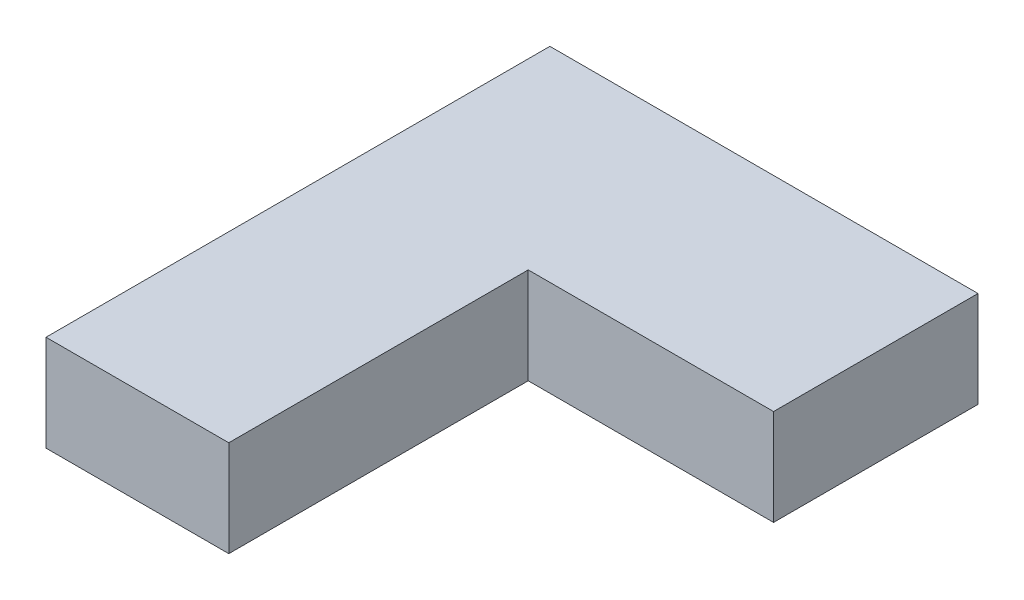
ISO-10303-21;
HEADER;
FILE_DESCRIPTION(('STEP AP214'),'2;1');
FILE_NAME('part.step','',(''),(''),'','','');
FILE_SCHEMA(('AUTOMOTIVE_DESIGN { 1 0 10303 214 1 1 1 1 }'));
ENDSEC;
DATA;
#1=APPLICATION_CONTEXT('core data for automotive mechanical design processes');
#2=APPLICATION_PROTOCOL_DEFINITION('international standard','automotive_design',2000,#1);
#3=PRODUCT_CONTEXT('',#1,'mechanical');
#4=PRODUCT('Part','Part','',(#3));
#5=PRODUCT_RELATED_PRODUCT_CATEGORY('part','',(#4));
#6=PRODUCT_DEFINITION_FORMATION('','',#4);
#7=PRODUCT_DEFINITION_CONTEXT('part definition',#1,'design');
#8=PRODUCT_DEFINITION('design','',#6,#7);
#9=PRODUCT_DEFINITION_SHAPE('','',#8);
#10=(LENGTH_UNIT() NAMED_UNIT(*) SI_UNIT(.MILLI.,.METRE.));
#11=(NAMED_UNIT(*) PLANE_ANGLE_UNIT() SI_UNIT($,.RADIAN.));
#12=(NAMED_UNIT(*) SI_UNIT($,.STERADIAN.) SOLID_ANGLE_UNIT());
#13=UNCERTAINTY_MEASURE_WITH_UNIT(LENGTH_MEASURE(1.E-05),#10,'distance_accuracy_value','');
#14=(GEOMETRIC_REPRESENTATION_CONTEXT(3) GLOBAL_UNCERTAINTY_ASSIGNED_CONTEXT((#13)) GLOBAL_UNIT_ASSIGNED_CONTEXT((#10,
#11,#12)) REPRESENTATION_CONTEXT('',''));
#15=CARTESIAN_POINT('',(0.,0.,0.));
#16=DIRECTION('',(0.,0.,1.));
#17=DIRECTION('',(1.,0.,0.));
#18=AXIS2_PLACEMENT_3D('',#15,#16,#17);
#19=CARTESIAN_POINT('',(44.5690110838464,10.,-52.456223719471));
#20=DIRECTION('',(1.,0.,0.));
#21=DIRECTION('',(0.,0.,-1.));
#22=AXIS2_PLACEMENT_3D('',#19,#20,#21);
#23=PLANE('',#22);
#24=DIRECTION('',(0.,0.,1.));
#25=VECTOR('',#24,1.);
#26=CARTESIAN_POINT('',(44.5690110838464,0.,-52.456223719471));
#27=LINE('',#26,#25);
#28=CARTESIAN_POINT('',(44.5690110838464,0.,-52.456223719471));
#29=VERTEX_POINT('',#28);
#30=CARTESIAN_POINT('',(44.5690110838464,0.,-31.1732689884207));
#31=VERTEX_POINT('',#30);
#32=EDGE_CURVE('E118',#29,#31,#27,.T.);
#33=ORIENTED_EDGE('',*,*,#32,.F.);
#34=DIRECTION('',(0.,-1.,0.));
#35=VECTOR('',#34,1.);
#36=CARTESIAN_POINT('',(44.5690110838464,10.,-52.456223719471));
#37=LINE('',#36,#35);
#38=CARTESIAN_POINT('',(44.5690110838464,10.,-52.456223719471));
#39=VERTEX_POINT('',#38);
#40=EDGE_CURVE('E11',#39,#29,#37,.T.);
#41=ORIENTED_EDGE('',*,*,#40,.F.);
#42=DIRECTION('',(0.,0.,1.));
#43=VECTOR('',#42,1.);
#44=CARTESIAN_POINT('',(44.5690110838464,10.,-52.456223719471));
#45=LINE('',#44,#43);
#46=CARTESIAN_POINT('',(44.5690110838464,10.,-31.1732689884207));
#47=VERTEX_POINT('',#46);
#48=EDGE_CURVE('E132',#39,#47,#45,.T.);
#49=ORIENTED_EDGE('',*,*,#48,.T.);
#50=DIRECTION('',(0.,-1.,0.));
#51=VECTOR('',#50,1.);
#52=CARTESIAN_POINT('',(44.5690110838464,10.,-31.1732689884207));
#53=LINE('',#52,#51);
#54=EDGE_CURVE('E36',#47,#31,#53,.T.);
#55=ORIENTED_EDGE('',*,*,#54,.T.);
#56=EDGE_LOOP('',(#33,#41,#49,#55));
#57=FACE_BOUND('',#56,.T.);
#58=ADVANCED_FACE('F33',(#57),#23,.T.);
#59=CARTESIAN_POINT('',(0.,10.,-52.456223719471));
#60=DIRECTION('',(0.,0.,-1.));
#61=DIRECTION('',(-1.,0.,0.));
#62=AXIS2_PLACEMENT_3D('',#59,#60,#61);
#63=PLANE('',#62);
#64=DIRECTION('',(1.,0.,0.));
#65=VECTOR('',#64,1.);
#66=CARTESIAN_POINT('',(0.,0.,-52.456223719471));
#67=LINE('',#66,#65);
#68=CARTESIAN_POINT('',(0.,0.,-52.456223719471));
#69=VERTEX_POINT('',#68);
#70=EDGE_CURVE('E130',#69,#29,#67,.T.);
#71=ORIENTED_EDGE('',*,*,#70,.F.);
#72=DIRECTION('',(0.,-1.,0.));
#73=VECTOR('',#72,1.);
#74=CARTESIAN_POINT('',(0.,10.,-52.456223719471));
#75=LINE('',#74,#73);
#76=CARTESIAN_POINT('',(0.,10.,-52.456223719471));
#77=VERTEX_POINT('',#76);
#78=EDGE_CURVE('E42',#77,#69,#75,.T.);
#79=ORIENTED_EDGE('',*,*,#78,.F.);
#80=DIRECTION('',(1.,0.,0.));
#81=VECTOR('',#80,1.);
#82=CARTESIAN_POINT('',(0.,10.,-52.456223719471));
#83=LINE('',#82,#81);
#84=EDGE_CURVE('E108',#77,#39,#83,.T.);
#85=ORIENTED_EDGE('',*,*,#84,.T.);
#86=ORIENTED_EDGE('',*,*,#40,.T.);
#87=EDGE_LOOP('',(#71,#79,#85,#86));
#88=FACE_BOUND('',#87,.T.);
#89=ADVANCED_FACE('F140',(#88),#63,.T.);
#90=CARTESIAN_POINT('',(0.,10.,0.));
#91=DIRECTION('',(-1.,0.,0.));
#92=DIRECTION('',(0.,0.,1.));
#93=AXIS2_PLACEMENT_3D('',#90,#91,#92);
#94=PLANE('',#93);
#95=DIRECTION('',(0.,0.,-1.));
#96=VECTOR('',#95,1.);
#97=CARTESIAN_POINT('',(0.,0.,0.));
#98=LINE('',#97,#96);
#99=CARTESIAN_POINT('',(0.,0.,0.));
#100=VERTEX_POINT('',#99);
#101=EDGE_CURVE('E95',#100,#69,#98,.T.);
#102=ORIENTED_EDGE('',*,*,#101,.F.);
#103=DIRECTION('',(0.,-1.,0.));
#104=VECTOR('',#103,1.);
#105=CARTESIAN_POINT('',(0.,10.,0.));
#106=LINE('',#105,#104);
#107=CARTESIAN_POINT('',(0.,10.,0.));
#108=VERTEX_POINT('',#107);
#109=EDGE_CURVE('E90',#108,#100,#106,.T.);
#110=ORIENTED_EDGE('',*,*,#109,.F.);
#111=DIRECTION('',(0.,0.,-1.));
#112=VECTOR('',#111,1.);
#113=CARTESIAN_POINT('',(0.,10.,0.));
#114=LINE('',#113,#112);
#115=EDGE_CURVE('E93',#108,#77,#114,.T.);
#116=ORIENTED_EDGE('',*,*,#115,.T.);
#117=ORIENTED_EDGE('',*,*,#78,.T.);
#118=EDGE_LOOP('',(#102,#110,#116,#117));
#119=FACE_BOUND('',#118,.T.);
#120=ADVANCED_FACE('F92',(#119),#94,.T.);
#121=CARTESIAN_POINT('',(19.0294654065861,10.,0.));
#122=DIRECTION('',(0.,0.,1.));
#123=DIRECTION('',(1.,0.,0.));
#124=AXIS2_PLACEMENT_3D('',#121,#122,#123);
#125=PLANE('',#124);
#126=DIRECTION('',(-1.,0.,0.));
#127=VECTOR('',#126,1.);
#128=CARTESIAN_POINT('',(19.0294654065861,0.,0.));
#129=LINE('',#128,#127);
#130=CARTESIAN_POINT('',(19.0294654065861,0.,0.));
#131=VERTEX_POINT('',#130);
#132=EDGE_CURVE('E127',#131,#100,#129,.T.);
#133=ORIENTED_EDGE('',*,*,#132,.F.);
#134=DIRECTION('',(0.,-1.,0.));
#135=VECTOR('',#134,1.);
#136=CARTESIAN_POINT('',(19.0294654065861,10.,0.));
#137=LINE('',#136,#135);
#138=CARTESIAN_POINT('',(19.0294654065861,10.,0.));
#139=VERTEX_POINT('',#138);
#140=EDGE_CURVE('E100',#139,#131,#137,.T.);
#141=ORIENTED_EDGE('',*,*,#140,.F.);
#142=DIRECTION('',(-1.,0.,0.));
#143=VECTOR('',#142,1.);
#144=CARTESIAN_POINT('',(19.0294654065861,10.,0.));
#145=LINE('',#144,#143);
#146=EDGE_CURVE('E106',#139,#108,#145,.T.);
#147=ORIENTED_EDGE('',*,*,#146,.T.);
#148=ORIENTED_EDGE('',*,*,#109,.T.);
#149=EDGE_LOOP('',(#133,#141,#147,#148));
#150=FACE_BOUND('',#149,.T.);
#151=ADVANCED_FACE('F110',(#150),#125,.T.);
#152=CARTESIAN_POINT('',(19.0294654065861,10.,-31.1732689884207));
#153=DIRECTION('',(1.,0.,0.));
#154=DIRECTION('',(0.,0.,-1.));
#155=AXIS2_PLACEMENT_3D('',#152,#153,#154);
#156=PLANE('',#155);
#157=DIRECTION('',(0.,0.,1.));
#158=VECTOR('',#157,1.);
#159=CARTESIAN_POINT('',(19.0294654065861,0.,-31.1732689884207));
#160=LINE('',#159,#158);
#161=CARTESIAN_POINT('',(19.0294654065861,0.,-31.1732689884207));
#162=VERTEX_POINT('',#161);
#163=EDGE_CURVE('E124',#162,#131,#160,.T.);
#164=ORIENTED_EDGE('',*,*,#163,.F.);
#165=DIRECTION('',(0.,-1.,0.));
#166=VECTOR('',#165,1.);
#167=CARTESIAN_POINT('',(19.0294654065861,10.,-31.1732689884207));
#168=LINE('',#167,#166);
#169=CARTESIAN_POINT('',(19.0294654065861,10.,-31.1732689884207));
#170=VERTEX_POINT('',#169);
#171=EDGE_CURVE('E135',#170,#162,#168,.T.);
#172=ORIENTED_EDGE('',*,*,#171,.F.);
#173=DIRECTION('',(0.,0.,1.));
#174=VECTOR('',#173,1.);
#175=CARTESIAN_POINT('',(19.0294654065861,10.,-31.1732689884207));
#176=LINE('',#175,#174);
#177=EDGE_CURVE('E111',#170,#139,#176,.T.);
#178=ORIENTED_EDGE('',*,*,#177,.T.);
#179=ORIENTED_EDGE('',*,*,#140,.T.);
#180=EDGE_LOOP('',(#164,#172,#178,#179));
#181=FACE_BOUND('',#180,.T.);
#182=ADVANCED_FACE('F153',(#181),#156,.T.);
#183=CARTESIAN_POINT('',(44.5690110838464,10.,-31.1732689884207));
#184=DIRECTION('',(0.,0.,1.));
#185=DIRECTION('',(1.,0.,0.));
#186=AXIS2_PLACEMENT_3D('',#183,#184,#185);
#187=PLANE('',#186);
#188=DIRECTION('',(-1.,0.,0.));
#189=VECTOR('',#188,1.);
#190=CARTESIAN_POINT('',(44.5690110838464,0.,-31.1732689884207));
#191=LINE('',#190,#189);
#192=EDGE_CURVE('E121',#31,#162,#191,.T.);
#193=ORIENTED_EDGE('',*,*,#192,.F.);
#194=ORIENTED_EDGE('',*,*,#54,.F.);
#195=DIRECTION('',(-1.,0.,0.));
#196=VECTOR('',#195,1.);
#197=CARTESIAN_POINT('',(44.5690110838464,10.,-31.1732689884207));
#198=LINE('',#197,#196);
#199=EDGE_CURVE('E113',#47,#170,#198,.T.);
#200=ORIENTED_EDGE('',*,*,#199,.T.);
#201=ORIENTED_EDGE('',*,*,#171,.T.);
#202=EDGE_LOOP('',(#193,#194,#200,#201));
#203=FACE_BOUND('',#202,.T.);
#204=ADVANCED_FACE('F137',(#203),#187,.T.);
#205=CARTESIAN_POINT('',(0.,10.,0.));
#206=DIRECTION('',(0.,-1.,0.));
#207=DIRECTION('',(0.,0.,-1.));
#208=AXIS2_PLACEMENT_3D('',#205,#206,#207);
#209=PLANE('',#208);
#210=ORIENTED_EDGE('',*,*,#48,.F.);
#211=ORIENTED_EDGE('',*,*,#84,.F.);
#212=ORIENTED_EDGE('',*,*,#115,.F.);
#213=ORIENTED_EDGE('',*,*,#146,.F.);
#214=ORIENTED_EDGE('',*,*,#177,.F.);
#215=ORIENTED_EDGE('',*,*,#199,.F.);
#216=EDGE_LOOP('',(#210,#211,#212,#213,#214,#215));
#217=FACE_BOUND('',#216,.T.);
#218=ADVANCED_FACE('F104',(#217),#209,.F.);
#219=CARTESIAN_POINT('',(0.,0.,0.));
#220=DIRECTION('',(0.,-1.,0.));
#221=DIRECTION('',(0.,0.,-1.));
#222=AXIS2_PLACEMENT_3D('',#219,#220,#221);
#223=PLANE('',#222);
#224=ORIENTED_EDGE('',*,*,#32,.T.);
#225=ORIENTED_EDGE('',*,*,#192,.T.);
#226=ORIENTED_EDGE('',*,*,#163,.T.);
#227=ORIENTED_EDGE('',*,*,#132,.T.);
#228=ORIENTED_EDGE('',*,*,#101,.T.);
#229=ORIENTED_EDGE('',*,*,#70,.T.);
#230=EDGE_LOOP('',(#224,#225,#226,#227,#228,#229));
#231=FACE_BOUND('',#230,.T.);
#232=ADVANCED_FACE('F139',(#231),#223,.T.);
#233=CLOSED_SHELL('',(#58,#89,#120,#151,#182,#204,#218,#232));
#234=MANIFOLD_SOLID_BREP('B2',#233);
#235=ADVANCED_BREP_SHAPE_REPRESENTATION('',(#18,#234),#14);
#236=SHAPE_DEFINITION_REPRESENTATION(#9,#235);
ENDSEC;
END-ISO-10303-21;
